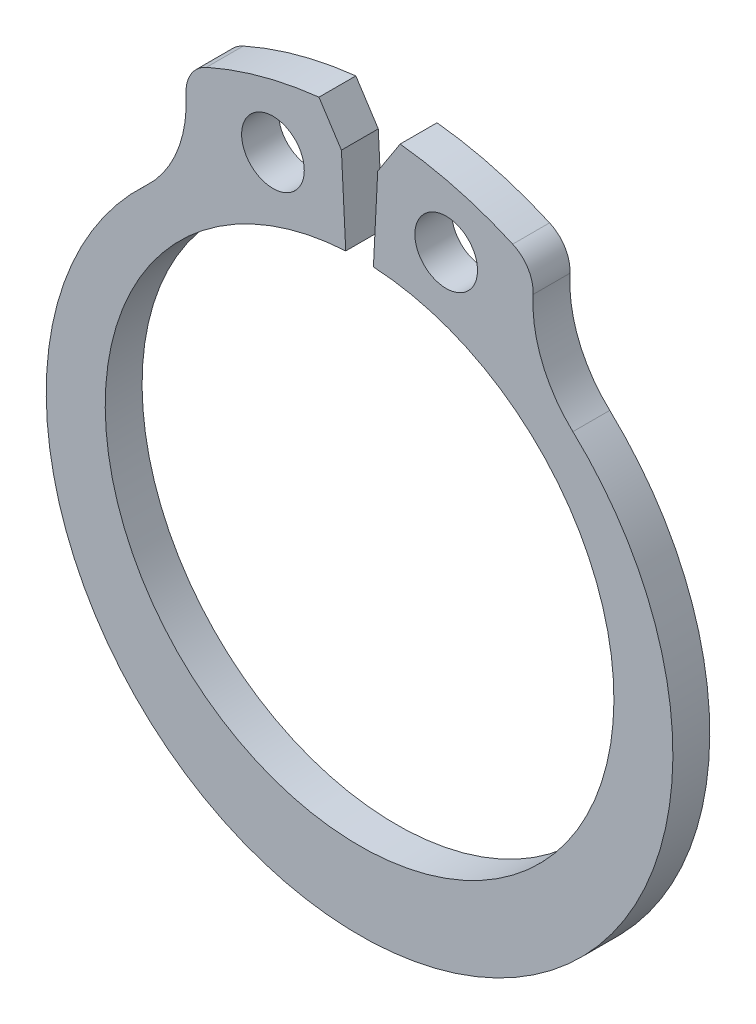
ISO-10303-21;
HEADER;
FILE_DESCRIPTION(('STEP AP214'),'2;1');
FILE_NAME('part.step','',(''),(''),'','','');
FILE_SCHEMA(('AUTOMOTIVE_DESIGN { 1 0 10303 214 1 1 1 1 }'));
ENDSEC;
DATA;
#1=APPLICATION_CONTEXT('core data for automotive mechanical design processes');
#2=APPLICATION_PROTOCOL_DEFINITION('international standard','automotive_design',2000,#1);
#3=PRODUCT_CONTEXT('',#1,'mechanical');
#4=PRODUCT('Part','Part','',(#3));
#5=PRODUCT_RELATED_PRODUCT_CATEGORY('part','',(#4));
#6=PRODUCT_DEFINITION_FORMATION('','',#4);
#7=PRODUCT_DEFINITION_CONTEXT('part definition',#1,'design');
#8=PRODUCT_DEFINITION('design','',#6,#7);
#9=PRODUCT_DEFINITION_SHAPE('','',#8);
#10=(LENGTH_UNIT() NAMED_UNIT(*) SI_UNIT(.MILLI.,.METRE.));
#11=(NAMED_UNIT(*) PLANE_ANGLE_UNIT() SI_UNIT($,.RADIAN.));
#12=(NAMED_UNIT(*) SI_UNIT($,.STERADIAN.) SOLID_ANGLE_UNIT());
#13=UNCERTAINTY_MEASURE_WITH_UNIT(LENGTH_MEASURE(1.E-05),#10,'distance_accuracy_value','');
#14=(GEOMETRIC_REPRESENTATION_CONTEXT(3) GLOBAL_UNCERTAINTY_ASSIGNED_CONTEXT((#13)) GLOBAL_UNIT_ASSIGNED_CONTEXT((#10,
#11,#12)) REPRESENTATION_CONTEXT('',''));
#15=CARTESIAN_POINT('',(0.,0.,0.));
#16=DIRECTION('',(0.,0.,1.));
#17=DIRECTION('',(1.,0.,0.));
#18=AXIS2_PLACEMENT_3D('',#15,#16,#17);
#19=CARTESIAN_POINT('',(3.2052280859158,0.383542694032375,1.));
#20=DIRECTION('',(0.,0.,1.));
#21=DIRECTION('',(1.,0.,0.));
#22=AXIS2_PLACEMENT_3D('',#19,#20,#21);
#23=PLANE('',#22);
#24=CARTESIAN_POINT('',(2.35,8.22070556582585,1.));
#25=DIRECTION('',(0.,0.,-1.));
#26=DIRECTION('',(1.,0.,0.));
#27=AXIS2_PLACEMENT_3D('',#24,#25,#26);
#28=CIRCLE('',#27,0.85);
#29=CARTESIAN_POINT('',(1.5,8.22070556582585,1.));
#30=VERTEX_POINT('',#29);
#31=EDGE_CURVE('E195',#30,#30,#28,.T.);
#32=ORIENTED_EDGE('',*,*,#31,.T.);
#33=EDGE_LOOP('',(#32));
#34=FACE_BOUND('',#33,.T.);
#35=CARTESIAN_POINT('',(-2.35,8.22070556582585,1.));
#36=DIRECTION('',(0.,0.,-1.));
#37=DIRECTION('',(-1.,0.,0.));
#38=AXIS2_PLACEMENT_3D('',#35,#36,#37);
#39=CIRCLE('',#38,0.85);
#40=CARTESIAN_POINT('',(-1.5,8.22070556582585,1.));
#41=VERTEX_POINT('',#40);
#42=EDGE_CURVE('E176',#41,#41,#39,.T.);
#43=ORIENTED_EDGE('',*,*,#42,.T.);
#44=EDGE_LOOP('',(#43));
#45=FACE_BOUND('',#44,.T.);
#46=CARTESIAN_POINT('',(0.,0.,1.));
#47=DIRECTION('',(0.,0.,-1.));
#48=DIRECTION('',(1.,0.,0.));
#49=AXIS2_PLACEMENT_3D('',#46,#47,#48);
#50=CIRCLE('',#49,6.9);
#51=CARTESIAN_POINT('',(0.375327304952594,6.88978442436025,1.));
#52=VERTEX_POINT('',#51);
#53=CARTESIAN_POINT('',(-0.375327304952594,6.88978442436025,1.));
#54=VERTEX_POINT('',#53);
#55=EDGE_CURVE('E149',#52,#54,#50,.T.);
#56=ORIENTED_EDGE('',*,*,#55,.T.);
#57=DIRECTION('',(-0.0507246376811596,0.99871267696576,0.));
#58=VECTOR('',#57,1.);
#59=CARTESIAN_POINT('',(0.,-0.5,1.));
#60=LINE('',#59,#58);
#61=CARTESIAN_POINT('',(-0.492663202195556,9.2,1.));
#62=VERTEX_POINT('',#61);
#63=EDGE_CURVE('E134',#54,#62,#60,.T.);
#64=ORIENTED_EDGE('',*,*,#63,.T.);
#65=DIRECTION('',(-0.543285163312526,0.83954823049333,0.));
#66=VECTOR('',#65,1.);
#67=CARTESIAN_POINT('',(-0.492663202195556,9.2,1.));
#68=LINE('',#67,#66);
#69=CARTESIAN_POINT('',(-1.10119989259703,10.1403825764388,1.));
#70=VERTEX_POINT('',#69);
#71=EDGE_CURVE('E209',#62,#70,#68,.T.);
#72=ORIENTED_EDGE('',*,*,#71,.T.);
#73=CARTESIAN_POINT('',(0.,0.,1.));
#74=DIRECTION('',(0.,0.,-1.));
#75=DIRECTION('',(-1.,0.,0.));
#76=AXIS2_PLACEMENT_3D('',#73,#74,#75);
#77=CIRCLE('',#76,10.2);
#78=CARTESIAN_POINT('',(-4.15451299978506,9.31557951684257,1.));
#79=VERTEX_POINT('',#78);
#80=EDGE_CURVE('E199',#79,#70,#77,.T.);
#81=ORIENTED_EDGE('',*,*,#80,.F.);
#82=CARTESIAN_POINT('',(-3.77368264147143,8.46165139446534,1.));
#83=DIRECTION('',(0.,0.,-1.));
#84=DIRECTION('',(-1.,0.,0.));
#85=AXIS2_PLACEMENT_3D('',#82,#83,#84);
#86=CIRCLE('',#85,0.935);
#87=CARTESIAN_POINT('',(-4.70718257513618,8.4087092198982,1.));
#88=VERTEX_POINT('',#87);
#89=EDGE_CURVE('E205',#88,#79,#86,.T.);
#90=ORIENTED_EDGE('',*,*,#89,.F.);
#91=CARTESIAN_POINT('',(-8.10172778846257,8.21619222147226,1.));
#92=DIRECTION('',(0.,0.,-1.));
#93=DIRECTION('',(-1.,0.,0.));
#94=AXIS2_PLACEMENT_3D('',#91,#92,#93);
#95=CIRCLE('',#94,3.4);
#96=CARTESIAN_POINT('',(-5.7869484203304,5.7258515867659,1.));
#97=VERTEX_POINT('',#96);
#98=EDGE_CURVE('E21',#88,#97,#95,.T.);
#99=ORIENTED_EDGE('',*,*,#98,.T.);
#100=CARTESIAN_POINT('',(0.,-0.5,1.));
#101=DIRECTION('',(0.,0.,-1.));
#102=DIRECTION('',(1.,0.,0.));
#103=AXIS2_PLACEMENT_3D('',#100,#101,#102);
#104=CIRCLE('',#103,8.5);
#105=CARTESIAN_POINT('',(5.7869484203304,5.7258515867659,1.));
#106=VERTEX_POINT('',#105);
#107=EDGE_CURVE('E11',#106,#97,#104,.T.);
#108=ORIENTED_EDGE('',*,*,#107,.F.);
#109=CARTESIAN_POINT('',(8.10172778846257,8.21619222147226,1.));
#110=DIRECTION('',(0.,0.,1.));
#111=DIRECTION('',(1.,0.,0.));
#112=AXIS2_PLACEMENT_3D('',#109,#110,#111);
#113=CIRCLE('',#112,3.4);
#114=CARTESIAN_POINT('',(4.70718257513618,8.4087092198982,1.));
#115=VERTEX_POINT('',#114);
#116=EDGE_CURVE('E221',#115,#106,#113,.T.);
#117=ORIENTED_EDGE('',*,*,#116,.F.);
#118=CARTESIAN_POINT('',(3.77368264147143,8.46165139446534,1.));
#119=DIRECTION('',(0.,0.,-1.));
#120=DIRECTION('',(1.,0.,0.));
#121=AXIS2_PLACEMENT_3D('',#118,#119,#120);
#122=CIRCLE('',#121,0.935);
#123=CARTESIAN_POINT('',(4.15451299978506,9.31557951684257,1.));
#124=VERTEX_POINT('',#123);
#125=EDGE_CURVE('E153',#124,#115,#122,.T.);
#126=ORIENTED_EDGE('',*,*,#125,.F.);
#127=CARTESIAN_POINT('',(0.,0.,1.));
#128=DIRECTION('',(0.,0.,-1.));
#129=DIRECTION('',(1.,0.,0.));
#130=AXIS2_PLACEMENT_3D('',#127,#128,#129);
#131=CIRCLE('',#130,10.2);
#132=CARTESIAN_POINT('',(1.10119989259703,10.1403825764388,1.));
#133=VERTEX_POINT('',#132);
#134=EDGE_CURVE('E163',#133,#124,#131,.T.);
#135=ORIENTED_EDGE('',*,*,#134,.F.);
#136=DIRECTION('',(0.543285163312526,0.83954823049333,0.));
#137=VECTOR('',#136,1.);
#138=CARTESIAN_POINT('',(0.492663202195556,9.2,1.));
#139=LINE('',#138,#137);
#140=CARTESIAN_POINT('',(0.492663202195556,9.2,1.));
#141=VERTEX_POINT('',#140);
#142=EDGE_CURVE('E164',#141,#133,#139,.T.);
#143=ORIENTED_EDGE('',*,*,#142,.F.);
#144=DIRECTION('',(0.0507246376811596,0.99871267696576,0.));
#145=VECTOR('',#144,1.);
#146=CARTESIAN_POINT('',(0.,-0.5,1.));
#147=LINE('',#146,#145);
#148=EDGE_CURVE('E172',#52,#141,#147,.T.);
#149=ORIENTED_EDGE('',*,*,#148,.F.);
#150=EDGE_LOOP('',(#56,#64,#72,#81,#90,#99,#108,#117,#126,#135,#143,#149));
#151=FACE_BOUND('',#150,.T.);
#152=ADVANCED_FACE('F17',(#34,#45,#151),#23,.T.);
#153=CARTESIAN_POINT('',(0.,-0.5,0.));
#154=DIRECTION('',(0.,0.,-1.));
#155=DIRECTION('',(1.,0.,0.));
#156=AXIS2_PLACEMENT_3D('',#153,#154,#155);
#157=CYLINDRICAL_SURFACE('',#156,8.5);
#158=ORIENTED_EDGE('',*,*,#107,.T.);
#159=DIRECTION('',(0.,0.,-1.));
#160=VECTOR('',#159,1.);
#161=CARTESIAN_POINT('',(-5.7869484203304,5.7258515867659,1.));
#162=LINE('',#161,#160);
#163=CARTESIAN_POINT('',(-5.7869484203304,5.7258515867659,0.));
#164=VERTEX_POINT('',#163);
#165=EDGE_CURVE('E206',#97,#164,#162,.T.);
#166=ORIENTED_EDGE('',*,*,#165,.T.);
#167=CARTESIAN_POINT('',(0.,-0.5,0.));
#168=DIRECTION('',(0.,0.,1.));
#169=DIRECTION('',(1.,0.,0.));
#170=AXIS2_PLACEMENT_3D('',#167,#168,#169);
#171=CIRCLE('',#170,8.5);
#172=CARTESIAN_POINT('',(5.7869484203304,5.7258515867659,0.));
#173=VERTEX_POINT('',#172);
#174=EDGE_CURVE('E168',#164,#173,#171,.T.);
#175=ORIENTED_EDGE('',*,*,#174,.T.);
#176=DIRECTION('',(0.,0.,1.));
#177=VECTOR('',#176,1.);
#178=CARTESIAN_POINT('',(5.7869484203304,5.7258515867659,0.));
#179=LINE('',#178,#177);
#180=EDGE_CURVE('E27',#173,#106,#179,.T.);
#181=ORIENTED_EDGE('',*,*,#180,.T.);
#182=EDGE_LOOP('',(#158,#166,#175,#181));
#183=FACE_BOUND('',#182,.T.);
#184=ADVANCED_FACE('F226',(#183),#157,.T.);
#185=CARTESIAN_POINT('',(8.10172778846257,8.21619222147226,0.));
#186=DIRECTION('',(0.,0.,-1.));
#187=DIRECTION('',(1.,0.,0.));
#188=AXIS2_PLACEMENT_3D('',#185,#186,#187);
#189=CYLINDRICAL_SURFACE('',#188,3.4);
#190=ORIENTED_EDGE('',*,*,#116,.T.);
#191=ORIENTED_EDGE('',*,*,#180,.F.);
#192=CARTESIAN_POINT('',(8.10172778846257,8.21619222147226,0.));
#193=DIRECTION('',(0.,0.,1.));
#194=DIRECTION('',(1.,0.,0.));
#195=AXIS2_PLACEMENT_3D('',#192,#193,#194);
#196=CIRCLE('',#195,3.4);
#197=CARTESIAN_POINT('',(4.70718257513618,8.4087092198982,0.));
#198=VERTEX_POINT('',#197);
#199=EDGE_CURVE('E165',#198,#173,#196,.T.);
#200=ORIENTED_EDGE('',*,*,#199,.F.);
#201=DIRECTION('',(0.,0.,1.));
#202=VECTOR('',#201,1.);
#203=CARTESIAN_POINT('',(4.70718257513618,8.4087092198982,0.));
#204=LINE('',#203,#202);
#205=EDGE_CURVE('E101',#198,#115,#204,.T.);
#206=ORIENTED_EDGE('',*,*,#205,.T.);
#207=EDGE_LOOP('',(#190,#191,#200,#206));
#208=FACE_BOUND('',#207,.T.);
#209=ADVANCED_FACE('F229',(#208),#189,.F.);
#210=CARTESIAN_POINT('',(3.77368264147143,8.46165139446534,0.));
#211=DIRECTION('',(0.,0.,-1.));
#212=DIRECTION('',(1.,0.,0.));
#213=AXIS2_PLACEMENT_3D('',#210,#211,#212);
#214=CYLINDRICAL_SURFACE('',#213,0.935);
#215=ORIENTED_EDGE('',*,*,#125,.T.);
#216=ORIENTED_EDGE('',*,*,#205,.F.);
#217=CARTESIAN_POINT('',(3.77368264147143,8.46165139446534,0.));
#218=DIRECTION('',(0.,0.,1.));
#219=DIRECTION('',(1.,0.,0.));
#220=AXIS2_PLACEMENT_3D('',#217,#218,#219);
#221=CIRCLE('',#220,0.935);
#222=CARTESIAN_POINT('',(4.15451299978506,9.31557951684257,0.));
#223=VERTEX_POINT('',#222);
#224=EDGE_CURVE('E169',#198,#223,#221,.T.);
#225=ORIENTED_EDGE('',*,*,#224,.T.);
#226=DIRECTION('',(0.,0.,1.));
#227=VECTOR('',#226,1.);
#228=CARTESIAN_POINT('',(4.15451299978506,9.31557951684257,0.));
#229=LINE('',#228,#227);
#230=EDGE_CURVE('E94',#223,#124,#229,.T.);
#231=ORIENTED_EDGE('',*,*,#230,.T.);
#232=EDGE_LOOP('',(#215,#216,#225,#231));
#233=FACE_BOUND('',#232,.T.);
#234=ADVANCED_FACE('F231',(#233),#214,.T.);
#235=CARTESIAN_POINT('',(0.,0.,0.));
#236=DIRECTION('',(0.,0.,-1.));
#237=DIRECTION('',(1.,0.,0.));
#238=AXIS2_PLACEMENT_3D('',#235,#236,#237);
#239=CYLINDRICAL_SURFACE('',#238,10.2);
#240=ORIENTED_EDGE('',*,*,#134,.T.);
#241=ORIENTED_EDGE('',*,*,#230,.F.);
#242=CARTESIAN_POINT('',(0.,0.,0.));
#243=DIRECTION('',(0.,0.,1.));
#244=DIRECTION('',(1.,0.,0.));
#245=AXIS2_PLACEMENT_3D('',#242,#243,#244);
#246=CIRCLE('',#245,10.2);
#247=CARTESIAN_POINT('',(1.10119989259703,10.1403825764388,0.));
#248=VERTEX_POINT('',#247);
#249=EDGE_CURVE('E171',#223,#248,#246,.T.);
#250=ORIENTED_EDGE('',*,*,#249,.T.);
#251=DIRECTION('',(0.,0.,1.));
#252=VECTOR('',#251,1.);
#253=CARTESIAN_POINT('',(1.10119989259703,10.1403825764388,0.));
#254=LINE('',#253,#252);
#255=EDGE_CURVE('E160',#248,#133,#254,.T.);
#256=ORIENTED_EDGE('',*,*,#255,.T.);
#257=EDGE_LOOP('',(#240,#241,#250,#256));
#258=FACE_BOUND('',#257,.T.);
#259=ADVANCED_FACE('F234',(#258),#239,.T.);
#260=CARTESIAN_POINT('',(0.796931547396293,9.67019128821942,0.));
#261=DIRECTION('',(-0.839548230493331,0.543285163312526,0.));
#262=DIRECTION('',(-0.543285163312526,-0.83954823049333,0.));
#263=AXIS2_PLACEMENT_3D('',#260,#261,#262);
#264=PLANE('',#263);
#265=ORIENTED_EDGE('',*,*,#142,.T.);
#266=ORIENTED_EDGE('',*,*,#255,.F.);
#267=DIRECTION('',(0.543285163312526,0.83954823049333,0.));
#268=VECTOR('',#267,1.);
#269=CARTESIAN_POINT('',(0.492663202195556,9.2,0.));
#270=LINE('',#269,#268);
#271=CARTESIAN_POINT('',(0.492663202195556,9.2,0.));
#272=VERTEX_POINT('',#271);
#273=EDGE_CURVE('E133',#272,#248,#270,.T.);
#274=ORIENTED_EDGE('',*,*,#273,.F.);
#275=DIRECTION('',(0.,0.,1.));
#276=VECTOR('',#275,1.);
#277=CARTESIAN_POINT('',(0.492663202195556,9.2,0.));
#278=LINE('',#277,#276);
#279=EDGE_CURVE('E129',#272,#141,#278,.T.);
#280=ORIENTED_EDGE('',*,*,#279,.T.);
#281=EDGE_LOOP('',(#265,#266,#274,#280));
#282=FACE_BOUND('',#281,.T.);
#283=ADVANCED_FACE('F256',(#282),#264,.T.);
#284=CARTESIAN_POINT('',(0.259029106309004,4.6,0.));
#285=DIRECTION('',(-0.99871267696576,0.0507246376811596,0.));
#286=DIRECTION('',(-0.0507246376811596,-0.99871267696576,0.));
#287=AXIS2_PLACEMENT_3D('',#284,#285,#286);
#288=PLANE('',#287);
#289=DIRECTION('',(0.,0.,1.));
#290=VECTOR('',#289,1.);
#291=CARTESIAN_POINT('',(0.375327304952594,6.88978442436025,0.5));
#292=LINE('',#291,#290);
#293=CARTESIAN_POINT('',(0.375327304952594,6.88978442436025,0.));
#294=VERTEX_POINT('',#293);
#295=EDGE_CURVE('E127',#294,#52,#292,.T.);
#296=ORIENTED_EDGE('',*,*,#295,.T.);
#297=ORIENTED_EDGE('',*,*,#148,.T.);
#298=ORIENTED_EDGE('',*,*,#279,.F.);
#299=DIRECTION('',(0.0507246376811596,0.99871267696576,0.));
#300=VECTOR('',#299,1.);
#301=CARTESIAN_POINT('',(0.,-0.5,0.));
#302=LINE('',#301,#300);
#303=EDGE_CURVE('E122',#294,#272,#302,.T.);
#304=ORIENTED_EDGE('',*,*,#303,.F.);
#305=EDGE_LOOP('',(#296,#297,#298,#304));
#306=FACE_BOUND('',#305,.T.);
#307=ADVANCED_FACE('F124',(#306),#288,.T.);
#308=CARTESIAN_POINT('',(2.35,8.22070556582585,0.5));
#309=DIRECTION('',(0.,0.,-1.));
#310=DIRECTION('',(1.,0.,0.));
#311=AXIS2_PLACEMENT_3D('',#308,#309,#310);
#312=CYLINDRICAL_SURFACE('',#311,0.85);
#313=ORIENTED_EDGE('',*,*,#31,.F.);
#314=EDGE_LOOP('',(#313));
#315=FACE_BOUND('',#314,.T.);
#316=CARTESIAN_POINT('',(2.35,8.22070556582585,0.));
#317=DIRECTION('',(0.,0.,1.));
#318=DIRECTION('',(1.,0.,0.));
#319=AXIS2_PLACEMENT_3D('',#316,#317,#318);
#320=CIRCLE('',#319,0.85);
#321=CARTESIAN_POINT('',(1.5,8.22070556582585,0.));
#322=VERTEX_POINT('',#321);
#323=EDGE_CURVE('E177',#322,#322,#320,.T.);
#324=ORIENTED_EDGE('',*,*,#323,.F.);
#325=EDGE_LOOP('',(#324));
#326=FACE_BOUND('',#325,.T.);
#327=ADVANCED_FACE('F19',(#315,#326),#312,.F.);
#328=CARTESIAN_POINT('',(-8.10172778846257,8.21619222147226,1.));
#329=DIRECTION('',(0.,0.,1.));
#330=DIRECTION('',(-1.,0.,0.));
#331=AXIS2_PLACEMENT_3D('',#328,#329,#330);
#332=CYLINDRICAL_SURFACE('',#331,3.4);
#333=CARTESIAN_POINT('',(-8.10172778846257,8.21619222147226,0.));
#334=DIRECTION('',(0.,0.,-1.));
#335=DIRECTION('',(-1.,0.,0.));
#336=AXIS2_PLACEMENT_3D('',#333,#334,#335);
#337=CIRCLE('',#336,3.4);
#338=CARTESIAN_POINT('',(-4.70718257513618,8.4087092198982,0.));
#339=VERTEX_POINT('',#338);
#340=EDGE_CURVE('E183',#339,#164,#337,.T.);
#341=ORIENTED_EDGE('',*,*,#340,.T.);
#342=ORIENTED_EDGE('',*,*,#165,.F.);
#343=ORIENTED_EDGE('',*,*,#98,.F.);
#344=DIRECTION('',(0.,0.,-1.));
#345=VECTOR('',#344,1.);
#346=CARTESIAN_POINT('',(-4.70718257513618,8.4087092198982,1.));
#347=LINE('',#346,#345);
#348=EDGE_CURVE('E201',#88,#339,#347,.T.);
#349=ORIENTED_EDGE('',*,*,#348,.T.);
#350=EDGE_LOOP('',(#341,#342,#343,#349));
#351=FACE_BOUND('',#350,.T.);
#352=ADVANCED_FACE('F254',(#351),#332,.F.);
#353=CARTESIAN_POINT('',(-3.77368264147143,8.46165139446534,1.));
#354=DIRECTION('',(0.,0.,1.));
#355=DIRECTION('',(-1.,0.,0.));
#356=AXIS2_PLACEMENT_3D('',#353,#354,#355);
#357=CYLINDRICAL_SURFACE('',#356,0.935);
#358=CARTESIAN_POINT('',(-3.77368264147143,8.46165139446534,0.));
#359=DIRECTION('',(0.,0.,1.));
#360=DIRECTION('',(-1.,0.,0.));
#361=AXIS2_PLACEMENT_3D('',#358,#359,#360);
#362=CIRCLE('',#361,0.935);
#363=CARTESIAN_POINT('',(-4.15451299978506,9.31557951684257,0.));
#364=VERTEX_POINT('',#363);
#365=EDGE_CURVE('E159',#364,#339,#362,.T.);
#366=ORIENTED_EDGE('',*,*,#365,.T.);
#367=ORIENTED_EDGE('',*,*,#348,.F.);
#368=ORIENTED_EDGE('',*,*,#89,.T.);
#369=DIRECTION('',(0.,0.,-1.));
#370=VECTOR('',#369,1.);
#371=CARTESIAN_POINT('',(-4.15451299978506,9.31557951684257,1.));
#372=LINE('',#371,#370);
#373=EDGE_CURVE('E202',#79,#364,#372,.T.);
#374=ORIENTED_EDGE('',*,*,#373,.T.);
#375=EDGE_LOOP('',(#366,#367,#368,#374));
#376=FACE_BOUND('',#375,.T.);
#377=ADVANCED_FACE('F249',(#376),#357,.T.);
#378=CARTESIAN_POINT('',(0.,0.,1.));
#379=DIRECTION('',(0.,0.,1.));
#380=DIRECTION('',(-1.,0.,0.));
#381=AXIS2_PLACEMENT_3D('',#378,#379,#380);
#382=CYLINDRICAL_SURFACE('',#381,10.2);
#383=CARTESIAN_POINT('',(0.,0.,0.));
#384=DIRECTION('',(0.,0.,1.));
#385=DIRECTION('',(-1.,0.,0.));
#386=AXIS2_PLACEMENT_3D('',#383,#384,#385);
#387=CIRCLE('',#386,10.2);
#388=CARTESIAN_POINT('',(-1.10119989259703,10.1403825764388,0.));
#389=VERTEX_POINT('',#388);
#390=EDGE_CURVE('E155',#389,#364,#387,.T.);
#391=ORIENTED_EDGE('',*,*,#390,.T.);
#392=ORIENTED_EDGE('',*,*,#373,.F.);
#393=ORIENTED_EDGE('',*,*,#80,.T.);
#394=DIRECTION('',(0.,0.,-1.));
#395=VECTOR('',#394,1.);
#396=CARTESIAN_POINT('',(-1.10119989259703,10.1403825764388,1.));
#397=LINE('',#396,#395);
#398=EDGE_CURVE('E192',#70,#389,#397,.T.);
#399=ORIENTED_EDGE('',*,*,#398,.T.);
#400=EDGE_LOOP('',(#391,#392,#393,#399));
#401=FACE_BOUND('',#400,.T.);
#402=ADVANCED_FACE('F247',(#401),#382,.T.);
#403=CARTESIAN_POINT('',(-0.796931547396293,9.67019128821942,1.));
#404=DIRECTION('',(0.839548230493331,0.543285163312526,0.));
#405=DIRECTION('',(0.543285163312526,-0.83954823049333,0.));
#406=AXIS2_PLACEMENT_3D('',#403,#404,#405);
#407=PLANE('',#406);
#408=DIRECTION('',(-0.543285163312526,0.83954823049333,0.));
#409=VECTOR('',#408,1.);
#410=CARTESIAN_POINT('',(-0.492663202195556,9.2,0.));
#411=LINE('',#410,#409);
#412=CARTESIAN_POINT('',(-0.492663202195556,9.2,0.));
#413=VERTEX_POINT('',#412);
#414=EDGE_CURVE('E158',#413,#389,#411,.T.);
#415=ORIENTED_EDGE('',*,*,#414,.T.);
#416=ORIENTED_EDGE('',*,*,#398,.F.);
#417=ORIENTED_EDGE('',*,*,#71,.F.);
#418=DIRECTION('',(0.,0.,-1.));
#419=VECTOR('',#418,1.);
#420=CARTESIAN_POINT('',(-0.492663202195556,9.2,1.));
#421=LINE('',#420,#419);
#422=EDGE_CURVE('E180',#62,#413,#421,.T.);
#423=ORIENTED_EDGE('',*,*,#422,.T.);
#424=EDGE_LOOP('',(#415,#416,#417,#423));
#425=FACE_BOUND('',#424,.T.);
#426=ADVANCED_FACE('F242',(#425),#407,.T.);
#427=CARTESIAN_POINT('',(-2.35,8.22070556582585,0.5));
#428=DIRECTION('',(0.,0.,1.));
#429=DIRECTION('',(-1.,0.,0.));
#430=AXIS2_PLACEMENT_3D('',#427,#428,#429);
#431=CYLINDRICAL_SURFACE('',#430,0.85);
#432=CARTESIAN_POINT('',(-2.35,8.22070556582585,0.));
#433=DIRECTION('',(0.,0.,1.));
#434=DIRECTION('',(-1.,0.,0.));
#435=AXIS2_PLACEMENT_3D('',#432,#433,#434);
#436=CIRCLE('',#435,0.85);
#437=CARTESIAN_POINT('',(-1.5,8.22070556582585,0.));
#438=VERTEX_POINT('',#437);
#439=EDGE_CURVE('E174',#438,#438,#436,.T.);
#440=ORIENTED_EDGE('',*,*,#439,.F.);
#441=EDGE_LOOP('',(#440));
#442=FACE_BOUND('',#441,.T.);
#443=ORIENTED_EDGE('',*,*,#42,.F.);
#444=EDGE_LOOP('',(#443));
#445=FACE_BOUND('',#444,.T.);
#446=ADVANCED_FACE('F276',(#442,#445),#431,.F.);
#447=CARTESIAN_POINT('',(3.2052280859158,0.383542694032375,0.));
#448=DIRECTION('',(0.,0.,1.));
#449=DIRECTION('',(1.,0.,0.));
#450=AXIS2_PLACEMENT_3D('',#447,#448,#449);
#451=PLANE('',#450);
#452=ORIENTED_EDGE('',*,*,#439,.T.);
#453=EDGE_LOOP('',(#452));
#454=FACE_BOUND('',#453,.T.);
#455=ORIENTED_EDGE('',*,*,#323,.T.);
#456=EDGE_LOOP('',(#455));
#457=FACE_BOUND('',#456,.T.);
#458=CARTESIAN_POINT('',(0.,0.,0.));
#459=DIRECTION('',(0.,0.,1.));
#460=DIRECTION('',(1.,0.,0.));
#461=AXIS2_PLACEMENT_3D('',#458,#459,#460);
#462=CIRCLE('',#461,6.9);
#463=CARTESIAN_POINT('',(-0.375327304952594,6.88978442436025,0.));
#464=VERTEX_POINT('',#463);
#465=EDGE_CURVE('E137',#464,#294,#462,.T.);
#466=ORIENTED_EDGE('',*,*,#465,.T.);
#467=ORIENTED_EDGE('',*,*,#303,.T.);
#468=ORIENTED_EDGE('',*,*,#273,.T.);
#469=ORIENTED_EDGE('',*,*,#249,.F.);
#470=ORIENTED_EDGE('',*,*,#224,.F.);
#471=ORIENTED_EDGE('',*,*,#199,.T.);
#472=ORIENTED_EDGE('',*,*,#174,.F.);
#473=ORIENTED_EDGE('',*,*,#340,.F.);
#474=ORIENTED_EDGE('',*,*,#365,.F.);
#475=ORIENTED_EDGE('',*,*,#390,.F.);
#476=ORIENTED_EDGE('',*,*,#414,.F.);
#477=DIRECTION('',(-0.0507246376811596,0.99871267696576,0.));
#478=VECTOR('',#477,1.);
#479=CARTESIAN_POINT('',(0.,-0.5,0.));
#480=LINE('',#479,#478);
#481=EDGE_CURVE('E140',#464,#413,#480,.T.);
#482=ORIENTED_EDGE('',*,*,#481,.F.);
#483=EDGE_LOOP('',(#466,#467,#468,#469,#470,#471,#472,#473,#474,#475,#476,#482));
#484=FACE_BOUND('',#483,.T.);
#485=ADVANCED_FACE('F138',(#454,#457,#484),#451,.F.);
#486=CARTESIAN_POINT('',(-0.259029106309004,4.6,1.));
#487=DIRECTION('',(0.99871267696576,0.0507246376811596,0.));
#488=DIRECTION('',(0.0507246376811596,-0.99871267696576,0.));
#489=AXIS2_PLACEMENT_3D('',#486,#487,#488);
#490=PLANE('',#489);
#491=DIRECTION('',(0.,0.,-1.));
#492=VECTOR('',#491,1.);
#493=CARTESIAN_POINT('',(-0.375327304952594,6.88978442436025,0.5));
#494=LINE('',#493,#492);
#495=EDGE_CURVE('E144',#54,#464,#494,.T.);
#496=ORIENTED_EDGE('',*,*,#495,.T.);
#497=ORIENTED_EDGE('',*,*,#481,.T.);
#498=ORIENTED_EDGE('',*,*,#422,.F.);
#499=ORIENTED_EDGE('',*,*,#63,.F.);
#500=EDGE_LOOP('',(#496,#497,#498,#499));
#501=FACE_BOUND('',#500,.T.);
#502=ADVANCED_FACE('F240',(#501),#490,.T.);
#503=CARTESIAN_POINT('',(0.,0.,0.5));
#504=DIRECTION('',(0.,0.,-1.));
#505=DIRECTION('',(1.,0.,0.));
#506=AXIS2_PLACEMENT_3D('',#503,#504,#505);
#507=CYLINDRICAL_SURFACE('',#506,6.9);
#508=ORIENTED_EDGE('',*,*,#295,.F.);
#509=ORIENTED_EDGE('',*,*,#465,.F.);
#510=ORIENTED_EDGE('',*,*,#495,.F.);
#511=ORIENTED_EDGE('',*,*,#55,.F.);
#512=EDGE_LOOP('',(#508,#509,#510,#511));
#513=FACE_BOUND('',#512,.T.);
#514=ADVANCED_FACE('F147',(#513),#507,.F.);
#515=CLOSED_SHELL('',(#152,#184,#209,#234,#259,#283,#307,#327,#352,#377,#402,#426,#446,#485,
#502,#514));
#516=MANIFOLD_SOLID_BREP('B1',#515);
#517=ADVANCED_BREP_SHAPE_REPRESENTATION('',(#18,#516),#14);
#518=SHAPE_DEFINITION_REPRESENTATION(#9,#517);
ENDSEC;
END-ISO-10303-21;
